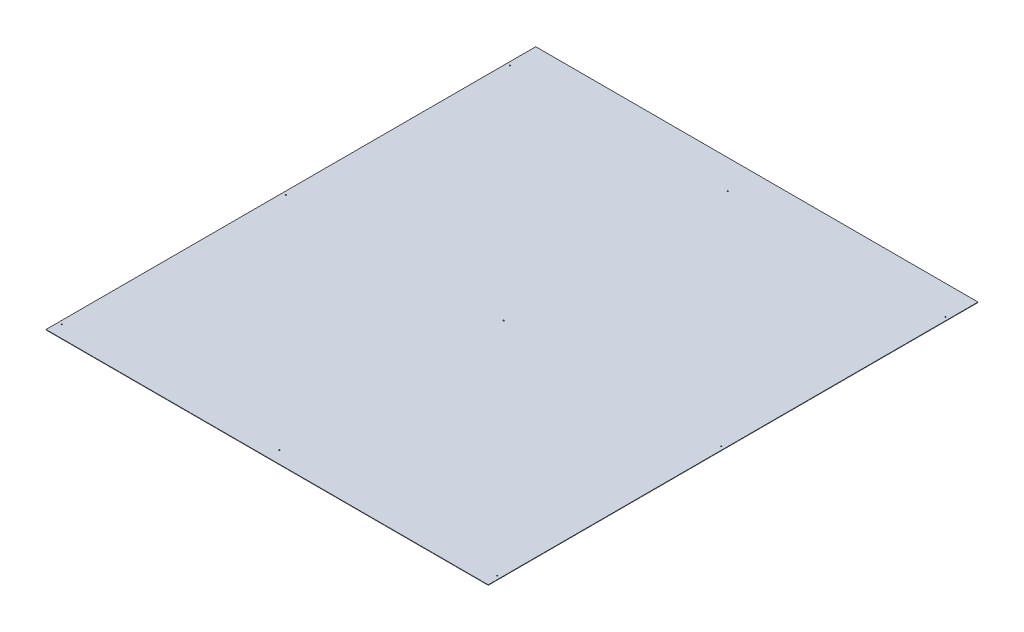
ISO-10303-21;
HEADER;
FILE_DESCRIPTION(('STEP AP214'),'2;1');
FILE_NAME('part.step','',(''),(''),'','','');
FILE_SCHEMA(('AUTOMOTIVE_DESIGN { 1 0 10303 214 1 1 1 1 }'));
ENDSEC;
DATA;
#1=APPLICATION_CONTEXT('core data for automotive mechanical design processes');
#2=APPLICATION_PROTOCOL_DEFINITION('international standard','automotive_design',2000,#1);
#3=PRODUCT_CONTEXT('',#1,'mechanical');
#4=PRODUCT('Part','Part','',(#3));
#5=PRODUCT_RELATED_PRODUCT_CATEGORY('part','',(#4));
#6=PRODUCT_DEFINITION_FORMATION('','',#4);
#7=PRODUCT_DEFINITION_CONTEXT('part definition',#1,'design');
#8=PRODUCT_DEFINITION('design','',#6,#7);
#9=PRODUCT_DEFINITION_SHAPE('','',#8);
#10=(LENGTH_UNIT() NAMED_UNIT(*) SI_UNIT(.MILLI.,.METRE.));
#11=(NAMED_UNIT(*) PLANE_ANGLE_UNIT() SI_UNIT($,.RADIAN.));
#12=(NAMED_UNIT(*) SI_UNIT($,.STERADIAN.) SOLID_ANGLE_UNIT());
#13=UNCERTAINTY_MEASURE_WITH_UNIT(LENGTH_MEASURE(1.E-05),#10,'distance_accuracy_value','');
#14=(GEOMETRIC_REPRESENTATION_CONTEXT(3) GLOBAL_UNCERTAINTY_ASSIGNED_CONTEXT((#13)) GLOBAL_UNIT_ASSIGNED_CONTEXT((#10,
#11,#12)) REPRESENTATION_CONTEXT('',''));
#15=CARTESIAN_POINT('',(0.,0.,0.));
#16=DIRECTION('',(0.,0.,1.));
#17=DIRECTION('',(1.,0.,0.));
#18=AXIS2_PLACEMENT_3D('',#15,#16,#17);
#19=CARTESIAN_POINT('',(6.18800000001003,0.762,-22.225));
#20=DIRECTION('',(0.,1.,0.));
#21=DIRECTION('',(0.,0.,1.));
#22=AXIS2_PLACEMENT_3D('',#19,#20,#21);
#23=CYLINDRICAL_SURFACE('',#22,0.965199999999989);
#24=CARTESIAN_POINT('',(6.18800000001003,0.,-22.225));
#25=DIRECTION('',(0.,-1.,0.));
#26=DIRECTION('',(0.,0.,-1.));
#27=AXIS2_PLACEMENT_3D('',#24,#25,#26);
#28=CIRCLE('',#27,0.965199999999989);
#29=CARTESIAN_POINT('',(6.18800000001003,0.,-23.1902));
#30=VERTEX_POINT('',#29);
#31=EDGE_CURVE('E192',#30,#30,#28,.T.);
#32=ORIENTED_EDGE('',*,*,#31,.T.);
#33=EDGE_LOOP('',(#32));
#34=FACE_BOUND('',#33,.T.);
#35=CARTESIAN_POINT('',(6.18800000001003,0.762,-22.225));
#36=DIRECTION('',(0.,1.,0.));
#37=DIRECTION('',(0.,0.,1.));
#38=AXIS2_PLACEMENT_3D('',#35,#36,#37);
#39=CIRCLE('',#38,0.965199999999989);
#40=CARTESIAN_POINT('',(6.18800000001003,0.762,-21.2598));
#41=VERTEX_POINT('',#40);
#42=EDGE_CURVE('E304',#41,#41,#39,.T.);
#43=ORIENTED_EDGE('',*,*,#42,.T.);
#44=EDGE_LOOP('',(#43));
#45=FACE_BOUND('',#44,.T.);
#46=ADVANCED_FACE('F17',(#34,#45),#23,.F.);
#47=CARTESIAN_POINT('',(795.43599999999,0.762,-22.225));
#48=DIRECTION('',(0.,1.,0.));
#49=DIRECTION('',(0.,0.,1.));
#50=AXIS2_PLACEMENT_3D('',#47,#48,#49);
#51=CYLINDRICAL_SURFACE('',#50,0.9652);
#52=CARTESIAN_POINT('',(795.43599999999,0.,-22.225));
#53=DIRECTION('',(0.,-1.,0.));
#54=DIRECTION('',(0.,0.,-1.));
#55=AXIS2_PLACEMENT_3D('',#52,#53,#54);
#56=CIRCLE('',#55,0.9652);
#57=CARTESIAN_POINT('',(795.43599999999,0.,-23.1902));
#58=VERTEX_POINT('',#57);
#59=EDGE_CURVE('E184',#58,#58,#56,.T.);
#60=ORIENTED_EDGE('',*,*,#59,.T.);
#61=EDGE_LOOP('',(#60));
#62=FACE_BOUND('',#61,.T.);
#63=CARTESIAN_POINT('',(795.43599999999,0.762,-22.225));
#64=DIRECTION('',(0.,1.,0.));
#65=DIRECTION('',(0.,0.,1.));
#66=AXIS2_PLACEMENT_3D('',#63,#64,#65);
#67=CIRCLE('',#66,0.9652);
#68=CARTESIAN_POINT('',(795.43599999999,0.762,-21.2598));
#69=VERTEX_POINT('',#68);
#70=EDGE_CURVE('E300',#69,#69,#67,.T.);
#71=ORIENTED_EDGE('',*,*,#70,.T.);
#72=EDGE_LOOP('',(#71));
#73=FACE_BOUND('',#72,.T.);
#74=ADVANCED_FACE('F430',(#62,#73),#51,.F.);
#75=CARTESIAN_POINT('',(795.43599999999,0.762,-428.625));
#76=DIRECTION('',(0.,1.,0.));
#77=DIRECTION('',(0.,0.,1.));
#78=AXIS2_PLACEMENT_3D('',#75,#76,#77);
#79=CYLINDRICAL_SURFACE('',#78,0.9652);
#80=CARTESIAN_POINT('',(795.43599999999,0.,-428.625));
#81=DIRECTION('',(0.,-1.,0.));
#82=DIRECTION('',(0.,0.,-1.));
#83=AXIS2_PLACEMENT_3D('',#80,#81,#82);
#84=CIRCLE('',#83,0.9652);
#85=CARTESIAN_POINT('',(795.43599999999,0.,-429.5902));
#86=VERTEX_POINT('',#85);
#87=EDGE_CURVE('E177',#86,#86,#84,.T.);
#88=ORIENTED_EDGE('',*,*,#87,.T.);
#89=EDGE_LOOP('',(#88));
#90=FACE_BOUND('',#89,.T.);
#91=CARTESIAN_POINT('',(795.43599999999,0.762,-428.625));
#92=DIRECTION('',(0.,1.,0.));
#93=DIRECTION('',(0.,0.,1.));
#94=AXIS2_PLACEMENT_3D('',#91,#92,#93);
#95=CIRCLE('',#94,0.9652);
#96=CARTESIAN_POINT('',(795.43599999999,0.762,-427.6598));
#97=VERTEX_POINT('',#96);
#98=EDGE_CURVE('E294',#97,#97,#95,.T.);
#99=ORIENTED_EDGE('',*,*,#98,.T.);
#100=EDGE_LOOP('',(#99));
#101=FACE_BOUND('',#100,.T.);
#102=ADVANCED_FACE('F437',(#90,#101),#79,.F.);
#103=CARTESIAN_POINT('',(795.43599999999,0.762,-835.025));
#104=DIRECTION('',(0.,1.,0.));
#105=DIRECTION('',(0.,0.,1.));
#106=AXIS2_PLACEMENT_3D('',#103,#104,#105);
#107=CYLINDRICAL_SURFACE('',#106,0.9652);
#108=CARTESIAN_POINT('',(795.43599999999,0.,-835.025));
#109=DIRECTION('',(0.,-1.,0.));
#110=DIRECTION('',(0.,0.,-1.));
#111=AXIS2_PLACEMENT_3D('',#108,#109,#110);
#112=CIRCLE('',#111,0.9652);
#113=CARTESIAN_POINT('',(795.43599999999,0.,-835.9902));
#114=VERTEX_POINT('',#113);
#115=EDGE_CURVE('E144',#114,#114,#112,.T.);
#116=ORIENTED_EDGE('',*,*,#115,.T.);
#117=EDGE_LOOP('',(#116));
#118=FACE_BOUND('',#117,.T.);
#119=CARTESIAN_POINT('',(795.43599999999,0.762,-835.025));
#120=DIRECTION('',(0.,1.,0.));
#121=DIRECTION('',(0.,0.,1.));
#122=AXIS2_PLACEMENT_3D('',#119,#120,#121);
#123=CIRCLE('',#122,0.9652);
#124=CARTESIAN_POINT('',(795.43599999999,0.762,-834.0598));
#125=VERTEX_POINT('',#124);
#126=EDGE_CURVE('E244',#125,#125,#123,.T.);
#127=ORIENTED_EDGE('',*,*,#126,.T.);
#128=EDGE_LOOP('',(#127));
#129=FACE_BOUND('',#128,.T.);
#130=ADVANCED_FACE('F465',(#118,#129),#107,.F.);
#131=CARTESIAN_POINT('',(400.812,0.762,-835.025));
#132=DIRECTION('',(0.,1.,0.));
#133=DIRECTION('',(0.,0.,1.));
#134=AXIS2_PLACEMENT_3D('',#131,#132,#133);
#135=CYLINDRICAL_SURFACE('',#134,0.9652);
#136=CARTESIAN_POINT('',(400.812,0.,-835.025));
#137=DIRECTION('',(0.,-1.,0.));
#138=DIRECTION('',(0.,0.,-1.));
#139=AXIS2_PLACEMENT_3D('',#136,#137,#138);
#140=CIRCLE('',#139,0.9652);
#141=CARTESIAN_POINT('',(400.812,0.,-835.9902));
#142=VERTEX_POINT('',#141);
#143=EDGE_CURVE('E136',#142,#142,#140,.T.);
#144=ORIENTED_EDGE('',*,*,#143,.T.);
#145=EDGE_LOOP('',(#144));
#146=FACE_BOUND('',#145,.T.);
#147=CARTESIAN_POINT('',(400.812,0.762,-835.025));
#148=DIRECTION('',(0.,1.,0.));
#149=DIRECTION('',(0.,0.,1.));
#150=AXIS2_PLACEMENT_3D('',#147,#148,#149);
#151=CIRCLE('',#150,0.9652);
#152=CARTESIAN_POINT('',(400.812,0.762,-834.0598));
#153=VERTEX_POINT('',#152);
#154=EDGE_CURVE('E261',#153,#153,#151,.T.);
#155=ORIENTED_EDGE('',*,*,#154,.T.);
#156=EDGE_LOOP('',(#155));
#157=FACE_BOUND('',#156,.T.);
#158=ADVANCED_FACE('F468',(#146,#157),#135,.F.);
#159=CARTESIAN_POINT('',(6.18800000001003,0.762,-835.025));
#160=DIRECTION('',(0.,1.,0.));
#161=DIRECTION('',(0.,0.,1.));
#162=AXIS2_PLACEMENT_3D('',#159,#160,#161);
#163=CYLINDRICAL_SURFACE('',#162,0.9652);
#164=CARTESIAN_POINT('',(6.18800000001003,0.,-835.025));
#165=DIRECTION('',(0.,-1.,0.));
#166=DIRECTION('',(0.,0.,-1.));
#167=AXIS2_PLACEMENT_3D('',#164,#165,#166);
#168=CIRCLE('',#167,0.9652);
#169=CARTESIAN_POINT('',(6.18800000001003,0.,-835.9902));
#170=VERTEX_POINT('',#169);
#171=EDGE_CURVE('E130',#170,#170,#168,.T.);
#172=ORIENTED_EDGE('',*,*,#171,.T.);
#173=EDGE_LOOP('',(#172));
#174=FACE_BOUND('',#173,.T.);
#175=CARTESIAN_POINT('',(6.18800000001003,0.762,-835.025));
#176=DIRECTION('',(0.,1.,0.));
#177=DIRECTION('',(0.,0.,1.));
#178=AXIS2_PLACEMENT_3D('',#175,#176,#177);
#179=CIRCLE('',#178,0.9652);
#180=CARTESIAN_POINT('',(6.18800000001003,0.762,-834.0598));
#181=VERTEX_POINT('',#180);
#182=EDGE_CURVE('E256',#181,#181,#179,.T.);
#183=ORIENTED_EDGE('',*,*,#182,.T.);
#184=EDGE_LOOP('',(#183));
#185=FACE_BOUND('',#184,.T.);
#186=ADVANCED_FACE('F131',(#174,#185),#163,.F.);
#187=CARTESIAN_POINT('',(6.18800000001003,0.762,-428.625));
#188=DIRECTION('',(0.,1.,0.));
#189=DIRECTION('',(0.,0.,1.));
#190=AXIS2_PLACEMENT_3D('',#187,#188,#189);
#191=CYLINDRICAL_SURFACE('',#190,0.9652);
#192=CARTESIAN_POINT('',(6.18800000001003,0.,-428.625));
#193=DIRECTION('',(0.,-1.,0.));
#194=DIRECTION('',(0.,0.,-1.));
#195=AXIS2_PLACEMENT_3D('',#192,#193,#194);
#196=CIRCLE('',#195,0.9652);
#197=CARTESIAN_POINT('',(6.18800000001003,0.,-429.5902));
#198=VERTEX_POINT('',#197);
#199=EDGE_CURVE('E135',#198,#198,#196,.T.);
#200=ORIENTED_EDGE('',*,*,#199,.T.);
#201=EDGE_LOOP('',(#200));
#202=FACE_BOUND('',#201,.T.);
#203=CARTESIAN_POINT('',(6.18800000001003,0.762,-428.625));
#204=DIRECTION('',(0.,1.,0.));
#205=DIRECTION('',(0.,0.,1.));
#206=AXIS2_PLACEMENT_3D('',#203,#204,#205);
#207=CIRCLE('',#206,0.9652);
#208=CARTESIAN_POINT('',(6.18800000001003,0.762,-427.6598));
#209=VERTEX_POINT('',#208);
#210=EDGE_CURVE('E260',#209,#209,#207,.T.);
#211=ORIENTED_EDGE('',*,*,#210,.T.);
#212=EDGE_LOOP('',(#211));
#213=FACE_BOUND('',#212,.T.);
#214=ADVANCED_FACE('F478',(#202,#213),#191,.F.);
#215=CARTESIAN_POINT('',(400.812,0.762,-428.625));
#216=DIRECTION('',(0.,1.,0.));
#217=DIRECTION('',(0.,0.,1.));
#218=AXIS2_PLACEMENT_3D('',#215,#216,#217);
#219=CYLINDRICAL_SURFACE('',#218,0.9652);
#220=CARTESIAN_POINT('',(400.812,0.,-428.625));
#221=DIRECTION('',(0.,-1.,0.));
#222=DIRECTION('',(0.,0.,-1.));
#223=AXIS2_PLACEMENT_3D('',#220,#221,#222);
#224=CIRCLE('',#223,0.9652);
#225=CARTESIAN_POINT('',(400.812,0.,-429.5902));
#226=VERTEX_POINT('',#225);
#227=EDGE_CURVE('E25',#226,#226,#224,.T.);
#228=ORIENTED_EDGE('',*,*,#227,.T.);
#229=EDGE_LOOP('',(#228));
#230=FACE_BOUND('',#229,.T.);
#231=CARTESIAN_POINT('',(400.812,0.762,-428.625));
#232=DIRECTION('',(0.,1.,0.));
#233=DIRECTION('',(0.,0.,1.));
#234=AXIS2_PLACEMENT_3D('',#231,#232,#233);
#235=CIRCLE('',#234,0.9652);
#236=CARTESIAN_POINT('',(400.812,0.762,-427.6598));
#237=VERTEX_POINT('',#236);
#238=EDGE_CURVE('E270',#237,#237,#235,.T.);
#239=ORIENTED_EDGE('',*,*,#238,.T.);
#240=EDGE_LOOP('',(#239));
#241=FACE_BOUND('',#240,.T.);
#242=ADVANCED_FACE('F475',(#230,#241),#219,.F.);
#243=CARTESIAN_POINT('',(400.812,0.762,-22.225));
#244=DIRECTION('',(0.,1.,0.));
#245=DIRECTION('',(0.,0.,1.));
#246=AXIS2_PLACEMENT_3D('',#243,#244,#245);
#247=CYLINDRICAL_SURFACE('',#246,0.9652);
#248=CARTESIAN_POINT('',(400.812,0.,-22.225));
#249=DIRECTION('',(0.,-1.,0.));
#250=DIRECTION('',(0.,0.,-1.));
#251=AXIS2_PLACEMENT_3D('',#248,#249,#250);
#252=CIRCLE('',#251,0.9652);
#253=CARTESIAN_POINT('',(400.812,0.,-23.1902));
#254=VERTEX_POINT('',#253);
#255=EDGE_CURVE('E11',#254,#254,#252,.T.);
#256=ORIENTED_EDGE('',*,*,#255,.T.);
#257=EDGE_LOOP('',(#256));
#258=FACE_BOUND('',#257,.T.);
#259=CARTESIAN_POINT('',(400.812,0.762,-22.225));
#260=DIRECTION('',(0.,1.,0.));
#261=DIRECTION('',(0.,0.,1.));
#262=AXIS2_PLACEMENT_3D('',#259,#260,#261);
#263=CIRCLE('',#262,0.9652);
#264=CARTESIAN_POINT('',(400.812,0.762,-21.2598));
#265=VERTEX_POINT('',#264);
#266=EDGE_CURVE('E249',#265,#265,#263,.T.);
#267=ORIENTED_EDGE('',*,*,#266,.T.);
#268=EDGE_LOOP('',(#267));
#269=FACE_BOUND('',#268,.T.);
#270=ADVANCED_FACE('F409',(#258,#269),#247,.F.);
#271=CARTESIAN_POINT('',(0.,0.,0.));
#272=DIRECTION('',(0.,-1.,0.));
#273=DIRECTION('',(0.,0.,-1.));
#274=AXIS2_PLACEMENT_3D('',#271,#272,#273);
#275=PLANE('',#274);
#276=ORIENTED_EDGE('',*,*,#255,.F.);
#277=EDGE_LOOP('',(#276));
#278=FACE_BOUND('',#277,.T.);
#279=ORIENTED_EDGE('',*,*,#227,.F.);
#280=EDGE_LOOP('',(#279));
#281=FACE_BOUND('',#280,.T.);
#282=ORIENTED_EDGE('',*,*,#199,.F.);
#283=EDGE_LOOP('',(#282));
#284=FACE_BOUND('',#283,.T.);
#285=ORIENTED_EDGE('',*,*,#171,.F.);
#286=EDGE_LOOP('',(#285));
#287=FACE_BOUND('',#286,.T.);
#288=ORIENTED_EDGE('',*,*,#143,.F.);
#289=EDGE_LOOP('',(#288));
#290=FACE_BOUND('',#289,.T.);
#291=ORIENTED_EDGE('',*,*,#115,.F.);
#292=EDGE_LOOP('',(#291));
#293=FACE_BOUND('',#292,.T.);
#294=ORIENTED_EDGE('',*,*,#87,.F.);
#295=EDGE_LOOP('',(#294));
#296=FACE_BOUND('',#295,.T.);
#297=ORIENTED_EDGE('',*,*,#59,.F.);
#298=EDGE_LOOP('',(#297));
#299=FACE_BOUND('',#298,.T.);
#300=ORIENTED_EDGE('',*,*,#31,.F.);
#301=EDGE_LOOP('',(#300));
#302=FACE_BOUND('',#301,.T.);
#303=DIRECTION('',(0.,0.,1.));
#304=VECTOR('',#303,1.);
#305=CARTESIAN_POINT('',(0.,0.,0.));
#306=LINE('',#305,#304);
#307=CARTESIAN_POINT('',(0.,0.,-887.73));
#308=VERTEX_POINT('',#307);
#309=CARTESIAN_POINT('',(0.,0.,0.));
#310=VERTEX_POINT('',#309);
#311=EDGE_CURVE('E248',#308,#310,#306,.T.);
#312=ORIENTED_EDGE('',*,*,#311,.F.);
#313=DIRECTION('',(-1.,0.,0.));
#314=VECTOR('',#313,1.);
#315=CARTESIAN_POINT('',(0.,0.,-887.73));
#316=LINE('',#315,#314);
#317=CARTESIAN_POINT('',(801.624,0.,-887.73));
#318=VERTEX_POINT('',#317);
#319=EDGE_CURVE('E200',#318,#308,#316,.T.);
#320=ORIENTED_EDGE('',*,*,#319,.F.);
#321=DIRECTION('',(0.,0.,-1.));
#322=VECTOR('',#321,1.);
#323=CARTESIAN_POINT('',(801.624,0.,0.));
#324=LINE('',#323,#322);
#325=CARTESIAN_POINT('',(801.624,0.,0.));
#326=VERTEX_POINT('',#325);
#327=EDGE_CURVE('E211',#326,#318,#324,.T.);
#328=ORIENTED_EDGE('',*,*,#327,.F.);
#329=DIRECTION('',(1.,0.,0.));
#330=VECTOR('',#329,1.);
#331=CARTESIAN_POINT('',(0.,0.,0.));
#332=LINE('',#331,#330);
#333=EDGE_CURVE('E229',#310,#326,#332,.T.);
#334=ORIENTED_EDGE('',*,*,#333,.F.);
#335=EDGE_LOOP('',(#312,#320,#328,#334));
#336=FACE_BOUND('',#335,.T.);
#337=ADVANCED_FACE('F442',(#278,#281,#284,#287,#290,#293,#296,#299,#302,#336),#275,.T.);
#338=CARTESIAN_POINT('',(0.,0.762,-887.73));
#339=DIRECTION('',(0.,0.,1.));
#340=DIRECTION('',(1.,0.,0.));
#341=AXIS2_PLACEMENT_3D('',#338,#339,#340);
#342=PLANE('',#341);
#343=ORIENTED_EDGE('',*,*,#319,.T.);
#344=DIRECTION('',(0.,-1.,0.));
#345=VECTOR('',#344,1.);
#346=CARTESIAN_POINT('',(0.,0.762,-887.73));
#347=LINE('',#346,#345);
#348=CARTESIAN_POINT('',(0.,0.762,-887.73));
#349=VERTEX_POINT('',#348);
#350=EDGE_CURVE('E238',#349,#308,#347,.T.);
#351=ORIENTED_EDGE('',*,*,#350,.F.);
#352=DIRECTION('',(-1.,0.,0.));
#353=VECTOR('',#352,1.);
#354=CARTESIAN_POINT('',(0.,0.762,-887.73));
#355=LINE('',#354,#353);
#356=CARTESIAN_POINT('',(801.624,0.762,-887.73));
#357=VERTEX_POINT('',#356);
#358=EDGE_CURVE('E318',#357,#349,#355,.T.);
#359=ORIENTED_EDGE('',*,*,#358,.F.);
#360=DIRECTION('',(0.,-1.,0.));
#361=VECTOR('',#360,1.);
#362=CARTESIAN_POINT('',(801.624,0.762,-887.73));
#363=LINE('',#362,#361);
#364=EDGE_CURVE('E206',#357,#318,#363,.T.);
#365=ORIENTED_EDGE('',*,*,#364,.T.);
#366=EDGE_LOOP('',(#343,#351,#359,#365));
#367=FACE_BOUND('',#366,.T.);
#368=ADVANCED_FACE('F445',(#367),#342,.F.);
#369=CARTESIAN_POINT('',(801.624,0.762,0.));
#370=DIRECTION('',(-1.,0.,0.));
#371=DIRECTION('',(0.,0.,1.));
#372=AXIS2_PLACEMENT_3D('',#369,#370,#371);
#373=PLANE('',#372);
#374=ORIENTED_EDGE('',*,*,#327,.T.);
#375=ORIENTED_EDGE('',*,*,#364,.F.);
#376=DIRECTION('',(0.,0.,-1.));
#377=VECTOR('',#376,1.);
#378=CARTESIAN_POINT('',(801.624,0.762,0.));
#379=LINE('',#378,#377);
#380=CARTESIAN_POINT('',(801.624,0.762,0.));
#381=VERTEX_POINT('',#380);
#382=EDGE_CURVE('E340',#381,#357,#379,.T.);
#383=ORIENTED_EDGE('',*,*,#382,.F.);
#384=DIRECTION('',(0.,-1.,0.));
#385=VECTOR('',#384,1.);
#386=CARTESIAN_POINT('',(801.624,0.762,0.));
#387=LINE('',#386,#385);
#388=EDGE_CURVE('E220',#381,#326,#387,.T.);
#389=ORIENTED_EDGE('',*,*,#388,.T.);
#390=EDGE_LOOP('',(#374,#375,#383,#389));
#391=FACE_BOUND('',#390,.T.);
#392=ADVANCED_FACE('F452',(#391),#373,.F.);
#393=CARTESIAN_POINT('',(0.,0.762,0.));
#394=DIRECTION('',(0.,0.,-1.));
#395=DIRECTION('',(0.,-1.,0.));
#396=AXIS2_PLACEMENT_3D('',#393,#394,#395);
#397=PLANE('',#396);
#398=ORIENTED_EDGE('',*,*,#333,.T.);
#399=ORIENTED_EDGE('',*,*,#388,.F.);
#400=DIRECTION('',(1.,0.,0.));
#401=VECTOR('',#400,1.);
#402=CARTESIAN_POINT('',(0.,0.762,0.));
#403=LINE('',#402,#401);
#404=CARTESIAN_POINT('',(0.,0.762,0.));
#405=VERTEX_POINT('',#404);
#406=EDGE_CURVE('E362',#405,#381,#403,.T.);
#407=ORIENTED_EDGE('',*,*,#406,.F.);
#408=DIRECTION('',(0.,-1.,0.));
#409=VECTOR('',#408,1.);
#410=CARTESIAN_POINT('',(0.,0.762,0.));
#411=LINE('',#410,#409);
#412=EDGE_CURVE('E279',#405,#310,#411,.T.);
#413=ORIENTED_EDGE('',*,*,#412,.T.);
#414=EDGE_LOOP('',(#398,#399,#407,#413));
#415=FACE_BOUND('',#414,.T.);
#416=ADVANCED_FACE('F449',(#415),#397,.F.);
#417=CARTESIAN_POINT('',(0.,0.762,0.));
#418=DIRECTION('',(1.,0.,0.));
#419=DIRECTION('',(0.,1.,0.));
#420=AXIS2_PLACEMENT_3D('',#417,#418,#419);
#421=PLANE('',#420);
#422=ORIENTED_EDGE('',*,*,#311,.T.);
#423=ORIENTED_EDGE('',*,*,#412,.F.);
#424=DIRECTION('',(0.,0.,1.));
#425=VECTOR('',#424,1.);
#426=CARTESIAN_POINT('',(0.,0.762,0.));
#427=LINE('',#426,#425);
#428=EDGE_CURVE('E371',#349,#405,#427,.T.);
#429=ORIENTED_EDGE('',*,*,#428,.F.);
#430=ORIENTED_EDGE('',*,*,#350,.T.);
#431=EDGE_LOOP('',(#422,#423,#429,#430));
#432=FACE_BOUND('',#431,.T.);
#433=ADVANCED_FACE('F392',(#432),#421,.F.);
#434=CARTESIAN_POINT('',(0.,0.762,0.));
#435=DIRECTION('',(0.,-1.,0.));
#436=DIRECTION('',(0.,0.,-1.));
#437=AXIS2_PLACEMENT_3D('',#434,#435,#436);
#438=PLANE('',#437);
#439=ORIENTED_EDGE('',*,*,#126,.F.);
#440=EDGE_LOOP('',(#439));
#441=FACE_BOUND('',#440,.T.);
#442=ORIENTED_EDGE('',*,*,#266,.F.);
#443=EDGE_LOOP('',(#442));
#444=FACE_BOUND('',#443,.T.);
#445=ORIENTED_EDGE('',*,*,#238,.F.);
#446=EDGE_LOOP('',(#445));
#447=FACE_BOUND('',#446,.T.);
#448=ORIENTED_EDGE('',*,*,#210,.F.);
#449=EDGE_LOOP('',(#448));
#450=FACE_BOUND('',#449,.T.);
#451=ORIENTED_EDGE('',*,*,#182,.F.);
#452=EDGE_LOOP('',(#451));
#453=FACE_BOUND('',#452,.T.);
#454=ORIENTED_EDGE('',*,*,#154,.F.);
#455=EDGE_LOOP('',(#454));
#456=FACE_BOUND('',#455,.T.);
#457=ORIENTED_EDGE('',*,*,#98,.F.);
#458=EDGE_LOOP('',(#457));
#459=FACE_BOUND('',#458,.T.);
#460=ORIENTED_EDGE('',*,*,#70,.F.);
#461=EDGE_LOOP('',(#460));
#462=FACE_BOUND('',#461,.T.);
#463=ORIENTED_EDGE('',*,*,#42,.F.);
#464=EDGE_LOOP('',(#463));
#465=FACE_BOUND('',#464,.T.);
#466=ORIENTED_EDGE('',*,*,#428,.T.);
#467=ORIENTED_EDGE('',*,*,#406,.T.);
#468=ORIENTED_EDGE('',*,*,#382,.T.);
#469=ORIENTED_EDGE('',*,*,#358,.T.);
#470=EDGE_LOOP('',(#466,#467,#468,#469));
#471=FACE_BOUND('',#470,.T.);
#472=ADVANCED_FACE('F386',(#441,#444,#447,#450,#453,#456,#459,#462,#465,#471),#438,.F.);
#473=CLOSED_SHELL('',(#46,#74,#102,#130,#158,#186,#214,#242,#270,#337,#368,#392,#416,#433,#472));
#474=MANIFOLD_SOLID_BREP('B1',#473);
#475=ADVANCED_BREP_SHAPE_REPRESENTATION('',(#18,#474),#14);
#476=SHAPE_DEFINITION_REPRESENTATION(#9,#475);
ENDSEC;
END-ISO-10303-21;
